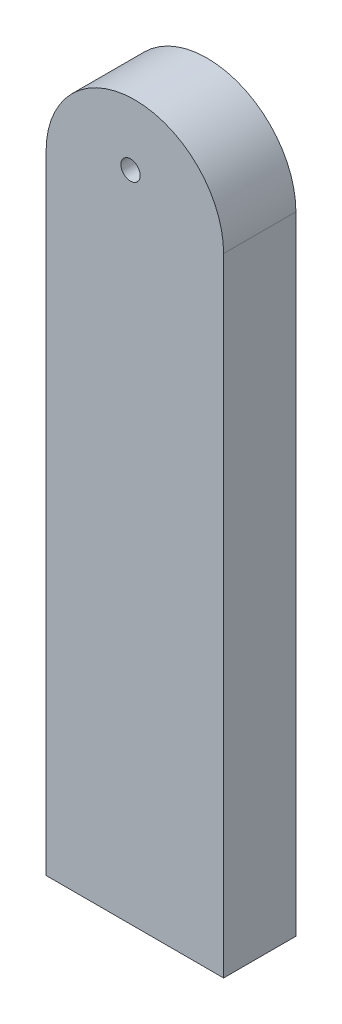
ISO-10303-21;
HEADER;
FILE_DESCRIPTION(('STEP AP214'),'2;1');
FILE_NAME('part.step','',(''),(''),'','','');
FILE_SCHEMA(('AUTOMOTIVE_DESIGN { 1 0 10303 214 1 1 1 1 }'));
ENDSEC;
DATA;
#1=APPLICATION_CONTEXT('core data for automotive mechanical design processes');
#2=APPLICATION_PROTOCOL_DEFINITION('international standard','automotive_design',2000,#1);
#3=PRODUCT_CONTEXT('',#1,'mechanical');
#4=PRODUCT('Part','Part','',(#3));
#5=PRODUCT_RELATED_PRODUCT_CATEGORY('part','',(#4));
#6=PRODUCT_DEFINITION_FORMATION('','',#4);
#7=PRODUCT_DEFINITION_CONTEXT('part definition',#1,'design');
#8=PRODUCT_DEFINITION('design','',#6,#7);
#9=PRODUCT_DEFINITION_SHAPE('','',#8);
#10=(LENGTH_UNIT() NAMED_UNIT(*) SI_UNIT(.MILLI.,.METRE.));
#11=(NAMED_UNIT(*) PLANE_ANGLE_UNIT() SI_UNIT($,.RADIAN.));
#12=(NAMED_UNIT(*) SI_UNIT($,.STERADIAN.) SOLID_ANGLE_UNIT());
#13=UNCERTAINTY_MEASURE_WITH_UNIT(LENGTH_MEASURE(1.E-05),#10,'distance_accuracy_value','');
#14=(GEOMETRIC_REPRESENTATION_CONTEXT(3) GLOBAL_UNCERTAINTY_ASSIGNED_CONTEXT((#13)) GLOBAL_UNIT_ASSIGNED_CONTEXT((#10,
#11,#12)) REPRESENTATION_CONTEXT('',''));
#15=CARTESIAN_POINT('',(0.,0.,0.));
#16=DIRECTION('',(0.,0.,1.));
#17=DIRECTION('',(1.,0.,0.));
#18=AXIS2_PLACEMENT_3D('',#15,#16,#17);
#19=CARTESIAN_POINT('',(19.2864494585836,31.2129861823679,14.98));
#20=DIRECTION('',(-1.,0.,0.));
#21=DIRECTION('',(0.,-1.,0.));
#22=AXIS2_PLACEMENT_3D('',#19,#20,#21);
#23=PLANE('',#22);
#24=DIRECTION('',(0.,1.,0.));
#25=VECTOR('',#24,1.);
#26=CARTESIAN_POINT('',(19.2864494585836,31.2129861823679,0.));
#27=LINE('',#26,#25);
#28=CARTESIAN_POINT('',(19.2864494585836,-98.7870138176321,0.));
#29=VERTEX_POINT('',#28);
#30=CARTESIAN_POINT('',(19.2864494585836,31.2129861823679,0.));
#31=VERTEX_POINT('',#30);
#32=EDGE_CURVE('E109',#29,#31,#27,.T.);
#33=ORIENTED_EDGE('',*,*,#32,.T.);
#34=DIRECTION('',(0.,0.,-1.));
#35=VECTOR('',#34,1.);
#36=CARTESIAN_POINT('',(19.2864494585836,31.2129861823679,14.98));
#37=LINE('',#36,#35);
#38=CARTESIAN_POINT('',(19.2864494585836,31.2129861823679,14.98));
#39=VERTEX_POINT('',#38);
#40=EDGE_CURVE('E11',#39,#31,#37,.T.);
#41=ORIENTED_EDGE('',*,*,#40,.F.);
#42=DIRECTION('',(0.,1.,0.));
#43=VECTOR('',#42,1.);
#44=CARTESIAN_POINT('',(19.2864494585836,31.2129861823679,14.98));
#45=LINE('',#44,#43);
#46=CARTESIAN_POINT('',(19.2864494585836,-98.7870138176321,14.98));
#47=VERTEX_POINT('',#46);
#48=EDGE_CURVE('E92',#47,#39,#45,.T.);
#49=ORIENTED_EDGE('',*,*,#48,.F.);
#50=DIRECTION('',(0.,0.,-1.));
#51=VECTOR('',#50,1.);
#52=CARTESIAN_POINT('',(19.2864494585836,-98.7870138176321,14.98));
#53=LINE('',#52,#51);
#54=EDGE_CURVE('E105',#47,#29,#53,.T.);
#55=ORIENTED_EDGE('',*,*,#54,.T.);
#56=EDGE_LOOP('',(#33,#41,#49,#55));
#57=FACE_BOUND('',#56,.T.);
#58=ADVANCED_FACE('F39',(#57),#23,.F.);
#59=CARTESIAN_POINT('',(0.896449458583607,31.2129861823679,14.98));
#60=DIRECTION('',(0.,0.,-1.));
#61=DIRECTION('',(-1.,0.,0.));
#62=AXIS2_PLACEMENT_3D('',#59,#60,#61);
#63=CYLINDRICAL_SURFACE('',#62,18.39);
#64=CARTESIAN_POINT('',(0.896449458583607,31.2129861823679,0.));
#65=DIRECTION('',(0.,0.,1.));
#66=DIRECTION('',(-1.,0.,0.));
#67=AXIS2_PLACEMENT_3D('',#64,#65,#66);
#68=CIRCLE('',#67,18.39);
#69=CARTESIAN_POINT('',(-17.4935505414164,31.2129861823679,0.));
#70=VERTEX_POINT('',#69);
#71=EDGE_CURVE('E97',#31,#70,#68,.T.);
#72=ORIENTED_EDGE('',*,*,#71,.T.);
#73=DIRECTION('',(0.,0.,-1.));
#74=VECTOR('',#73,1.);
#75=CARTESIAN_POINT('',(-17.4935505414164,31.2129861823679,14.98));
#76=LINE('',#75,#74);
#77=CARTESIAN_POINT('',(-17.4935505414164,31.2129861823679,14.98));
#78=VERTEX_POINT('',#77);
#79=EDGE_CURVE('E49',#78,#70,#76,.T.);
#80=ORIENTED_EDGE('',*,*,#79,.F.);
#81=CARTESIAN_POINT('',(0.896449458583607,31.2129861823679,14.98));
#82=DIRECTION('',(0.,0.,1.));
#83=DIRECTION('',(-1.,0.,0.));
#84=AXIS2_PLACEMENT_3D('',#81,#82,#83);
#85=CIRCLE('',#84,18.39);
#86=EDGE_CURVE('E87',#39,#78,#85,.T.);
#87=ORIENTED_EDGE('',*,*,#86,.F.);
#88=ORIENTED_EDGE('',*,*,#40,.T.);
#89=EDGE_LOOP('',(#72,#80,#87,#88));
#90=FACE_BOUND('',#89,.T.);
#91=ADVANCED_FACE('F96',(#90),#63,.T.);
#92=CARTESIAN_POINT('',(-17.4935505414164,31.2129861823679,14.98));
#93=DIRECTION('',(1.,0.,0.));
#94=DIRECTION('',(0.,1.,0.));
#95=AXIS2_PLACEMENT_3D('',#92,#93,#94);
#96=PLANE('',#95);
#97=DIRECTION('',(0.,-1.,0.));
#98=VECTOR('',#97,1.);
#99=CARTESIAN_POINT('',(-17.4935505414164,31.2129861823679,0.));
#100=LINE('',#99,#98);
#101=CARTESIAN_POINT('',(-17.4935505414164,-98.7870138176321,0.));
#102=VERTEX_POINT('',#101);
#103=EDGE_CURVE('E74',#70,#102,#100,.T.);
#104=ORIENTED_EDGE('',*,*,#103,.T.);
#105=DIRECTION('',(0.,0.,-1.));
#106=VECTOR('',#105,1.);
#107=CARTESIAN_POINT('',(-17.4935505414164,-98.7870138176321,14.98));
#108=LINE('',#107,#106);
#109=CARTESIAN_POINT('',(-17.4935505414164,-98.7870138176321,14.98));
#110=VERTEX_POINT('',#109);
#111=EDGE_CURVE('E99',#110,#102,#108,.T.);
#112=ORIENTED_EDGE('',*,*,#111,.F.);
#113=DIRECTION('',(0.,-1.,0.));
#114=VECTOR('',#113,1.);
#115=CARTESIAN_POINT('',(-17.4935505414164,31.2129861823679,14.98));
#116=LINE('',#115,#114);
#117=EDGE_CURVE('E90',#78,#110,#116,.T.);
#118=ORIENTED_EDGE('',*,*,#117,.F.);
#119=ORIENTED_EDGE('',*,*,#79,.T.);
#120=EDGE_LOOP('',(#104,#112,#118,#119));
#121=FACE_BOUND('',#120,.T.);
#122=ADVANCED_FACE('F101',(#121),#96,.F.);
#123=CARTESIAN_POINT('',(-17.4935505414164,-98.7870138176321,14.98));
#124=DIRECTION('',(0.,1.,0.));
#125=DIRECTION('',(0.,0.,1.));
#126=AXIS2_PLACEMENT_3D('',#123,#124,#125);
#127=PLANE('',#126);
#128=DIRECTION('',(1.,0.,0.));
#129=VECTOR('',#128,1.);
#130=CARTESIAN_POINT('',(-17.4935505414164,-98.7870138176321,0.));
#131=LINE('',#130,#129);
#132=EDGE_CURVE('E80',#102,#29,#131,.T.);
#133=ORIENTED_EDGE('',*,*,#132,.T.);
#134=ORIENTED_EDGE('',*,*,#54,.F.);
#135=DIRECTION('',(1.,0.,0.));
#136=VECTOR('',#135,1.);
#137=CARTESIAN_POINT('',(-17.4935505414164,-98.7870138176321,14.98));
#138=LINE('',#137,#136);
#139=EDGE_CURVE('E57',#110,#47,#138,.T.);
#140=ORIENTED_EDGE('',*,*,#139,.F.);
#141=ORIENTED_EDGE('',*,*,#111,.T.);
#142=EDGE_LOOP('',(#133,#134,#140,#141));
#143=FACE_BOUND('',#142,.T.);
#144=ADVANCED_FACE('F123',(#143),#127,.F.);
#145=CARTESIAN_POINT('',(0.896449458583607,31.2129861823679,14.98));
#146=DIRECTION('',(0.,0.,-1.));
#147=DIRECTION('',(-1.,0.,0.));
#148=AXIS2_PLACEMENT_3D('',#145,#146,#147);
#149=PLANE('',#148);
#150=CARTESIAN_POINT('',(0.,36.5621544401504,14.98));
#151=DIRECTION('',(0.,0.,-1.));
#152=DIRECTION('',(-1.,0.,0.));
#153=AXIS2_PLACEMENT_3D('',#150,#151,#152);
#154=CIRCLE('',#153,2.);
#155=CARTESIAN_POINT('',(-2.,36.5621544401504,14.98));
#156=VERTEX_POINT('',#155);
#157=EDGE_CURVE('E113',#156,#156,#154,.T.);
#158=ORIENTED_EDGE('',*,*,#157,.T.);
#159=EDGE_LOOP('',(#158));
#160=FACE_BOUND('',#159,.T.);
#161=ORIENTED_EDGE('',*,*,#48,.T.);
#162=ORIENTED_EDGE('',*,*,#86,.T.);
#163=ORIENTED_EDGE('',*,*,#117,.T.);
#164=ORIENTED_EDGE('',*,*,#139,.T.);
#165=EDGE_LOOP('',(#161,#162,#163,#164));
#166=FACE_BOUND('',#165,.T.);
#167=ADVANCED_FACE('F88',(#160,#166),#149,.F.);
#168=CARTESIAN_POINT('',(0.896449458583607,31.2129861823679,0.));
#169=DIRECTION('',(0.,0.,-1.));
#170=DIRECTION('',(-1.,0.,0.));
#171=AXIS2_PLACEMENT_3D('',#168,#169,#170);
#172=PLANE('',#171);
#173=CARTESIAN_POINT('',(0.,36.5621544401504,0.));
#174=DIRECTION('',(0.,0.,-1.));
#175=DIRECTION('',(-1.,0.,0.));
#176=AXIS2_PLACEMENT_3D('',#173,#174,#175);
#177=CIRCLE('',#176,2.);
#178=CARTESIAN_POINT('',(-2.,36.5621544401504,0.));
#179=VERTEX_POINT('',#178);
#180=EDGE_CURVE('E42',#179,#179,#177,.T.);
#181=ORIENTED_EDGE('',*,*,#180,.F.);
#182=EDGE_LOOP('',(#181));
#183=FACE_BOUND('',#182,.T.);
#184=ORIENTED_EDGE('',*,*,#32,.F.);
#185=ORIENTED_EDGE('',*,*,#132,.F.);
#186=ORIENTED_EDGE('',*,*,#103,.F.);
#187=ORIENTED_EDGE('',*,*,#71,.F.);
#188=EDGE_LOOP('',(#184,#185,#186,#187));
#189=FACE_BOUND('',#188,.T.);
#190=ADVANCED_FACE('F126',(#183,#189),#172,.T.);
#191=CARTESIAN_POINT('',(0.,36.5621544401504,-47.52));
#192=DIRECTION('',(0.,0.,1.));
#193=DIRECTION('',(1.,0.,0.));
#194=AXIS2_PLACEMENT_3D('',#191,#192,#193);
#195=CYLINDRICAL_SURFACE('',#194,2.);
#196=ORIENTED_EDGE('',*,*,#180,.T.);
#197=EDGE_LOOP('',(#196));
#198=FACE_BOUND('',#197,.T.);
#199=ORIENTED_EDGE('',*,*,#157,.F.);
#200=EDGE_LOOP('',(#199));
#201=FACE_BOUND('',#200,.T.);
#202=ADVANCED_FACE('F138',(#198,#201),#195,.F.);
#203=CLOSED_SHELL('',(#58,#91,#122,#144,#167,#190,#202));
#204=MANIFOLD_SOLID_BREP('B2',#203);
#205=ADVANCED_BREP_SHAPE_REPRESENTATION('',(#18,#204),#14);
#206=SHAPE_DEFINITION_REPRESENTATION(#9,#205);
ENDSEC;
END-ISO-10303-21;
